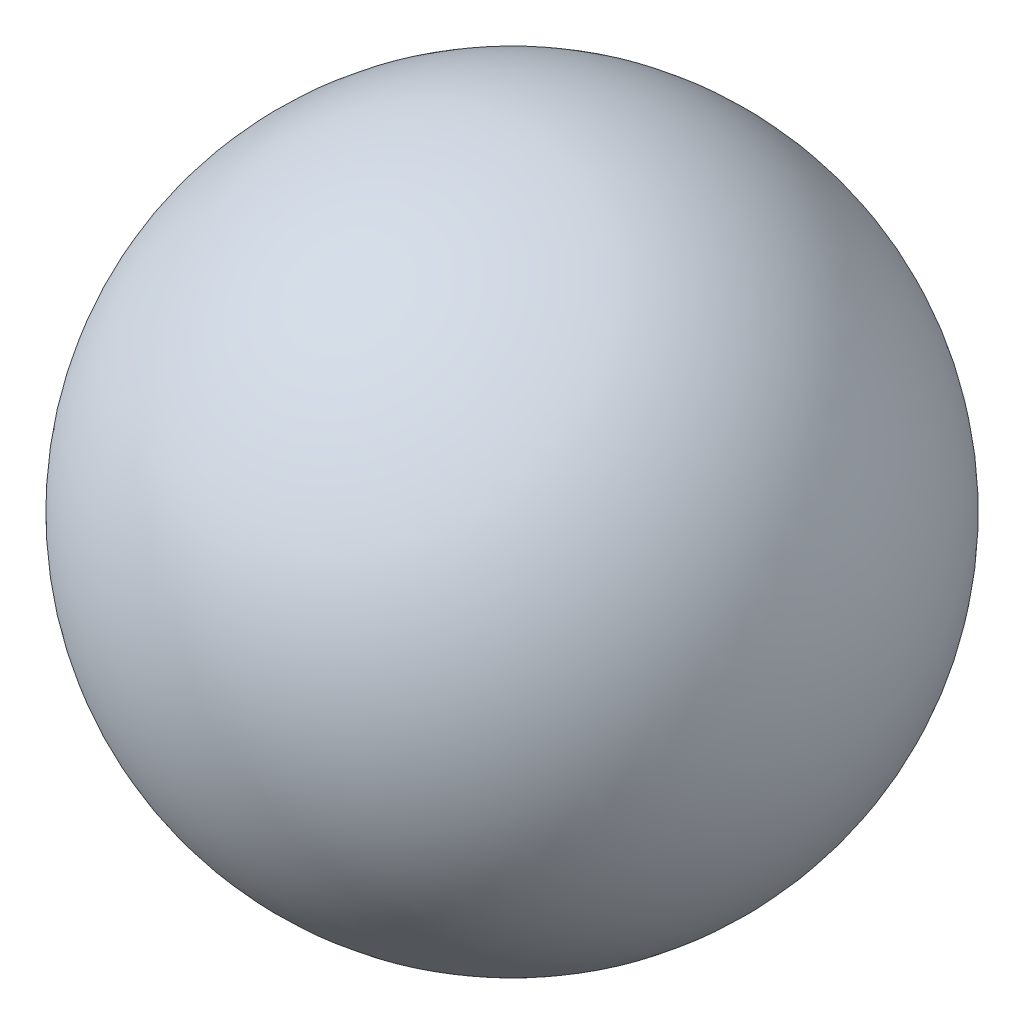
ISO-10303-21;
HEADER;
FILE_DESCRIPTION(('STEP AP214'),'2;1');
FILE_NAME('part.step','',(''),(''),'','','');
FILE_SCHEMA(('AUTOMOTIVE_DESIGN { 1 0 10303 214 1 1 1 1 }'));
ENDSEC;
DATA;
#1=APPLICATION_CONTEXT('core data for automotive mechanical design processes');
#2=APPLICATION_PROTOCOL_DEFINITION('international standard','automotive_design',2000,#1);
#3=PRODUCT_CONTEXT('',#1,'mechanical');
#4=PRODUCT('Part','Part','',(#3));
#5=PRODUCT_RELATED_PRODUCT_CATEGORY('part','',(#4));
#6=PRODUCT_DEFINITION_FORMATION('','',#4);
#7=PRODUCT_DEFINITION_CONTEXT('part definition',#1,'design');
#8=PRODUCT_DEFINITION('design','',#6,#7);
#9=PRODUCT_DEFINITION_SHAPE('','',#8);
#10=(LENGTH_UNIT() NAMED_UNIT(*) SI_UNIT(.MILLI.,.METRE.));
#11=(NAMED_UNIT(*) PLANE_ANGLE_UNIT() SI_UNIT($,.RADIAN.));
#12=(NAMED_UNIT(*) SI_UNIT($,.STERADIAN.) SOLID_ANGLE_UNIT());
#13=UNCERTAINTY_MEASURE_WITH_UNIT(LENGTH_MEASURE(1.E-05),#10,'distance_accuracy_value','');
#14=(GEOMETRIC_REPRESENTATION_CONTEXT(3) GLOBAL_UNCERTAINTY_ASSIGNED_CONTEXT((#13)) GLOBAL_UNIT_ASSIGNED_CONTEXT((#10,
#11,#12)) REPRESENTATION_CONTEXT('',''));
#15=CARTESIAN_POINT('',(0.,0.,0.));
#16=DIRECTION('',(0.,0.,1.));
#17=DIRECTION('',(1.,0.,0.));
#18=AXIS2_PLACEMENT_3D('',#15,#16,#17);
#19=CARTESIAN_POINT('',(0.,0.,0.));
#20=DIRECTION('',(0.,1.,0.));
#21=DIRECTION('',(1.,0.,0.));
#22=AXIS2_PLACEMENT_3D('',#19,#20,#21);
#23=SPHERICAL_SURFACE('',#22,20.);
#24=CARTESIAN_POINT('',(0.,20.,0.));
#25=VERTEX_POINT('',#24);
#26=VERTEX_LOOP('',#25);
#27=FACE_BOUND('',#26,.T.);
#28=ADVANCED_FACE('F37',(#27),#23,.T.);
#29=CLOSED_SHELL('',(#28));
#30=CARTESIAN_POINT('',(0.,0.,0.));
#31=DIRECTION('',(0.,1.,0.));
#32=DIRECTION('',(1.,0.,0.));
#33=AXIS2_PLACEMENT_3D('',#30,#31,#32);
#34=SPHERICAL_SURFACE('',#33,19.6);
#35=CARTESIAN_POINT('',(0.,19.6,0.));
#36=VERTEX_POINT('',#35);
#37=VERTEX_LOOP('',#36);
#38=FACE_BOUND('',#37,.T.);
#39=ADVANCED_FACE('F39',(#38),#34,.F.);
#40=CLOSED_SHELL('',(#39));
#41=ORIENTED_CLOSED_SHELL('',*,#40,.T.);
#42=BREP_WITH_VOIDS('B2',#29,(#41));
#43=ADVANCED_BREP_SHAPE_REPRESENTATION('',(#18,#42),#14);
#44=SHAPE_DEFINITION_REPRESENTATION(#9,#43);
ENDSEC;
END-ISO-10303-21;
